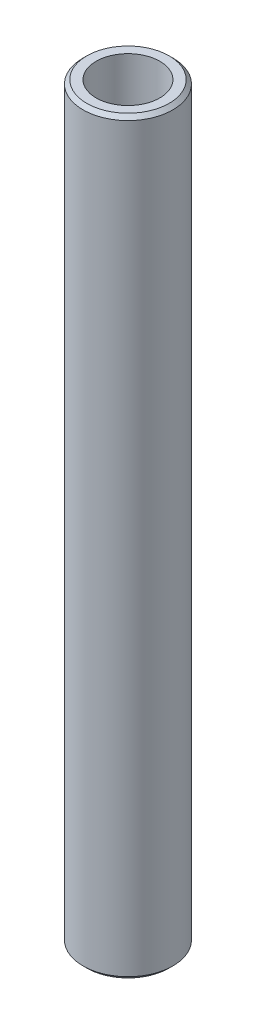
ISO-10303-21;
HEADER;
FILE_DESCRIPTION(('STEP AP214'),'2;1');
FILE_NAME('part.step','',(''),(''),'','','');
FILE_SCHEMA(('AUTOMOTIVE_DESIGN { 1 0 10303 214 1 1 1 1 }'));
ENDSEC;
DATA;
#1=APPLICATION_CONTEXT('core data for automotive mechanical design processes');
#2=APPLICATION_PROTOCOL_DEFINITION('international standard','automotive_design',2000,#1);
#3=PRODUCT_CONTEXT('',#1,'mechanical');
#4=PRODUCT('Part','Part','',(#3));
#5=PRODUCT_RELATED_PRODUCT_CATEGORY('part','',(#4));
#6=PRODUCT_DEFINITION_FORMATION('','',#4);
#7=PRODUCT_DEFINITION_CONTEXT('part definition',#1,'design');
#8=PRODUCT_DEFINITION('design','',#6,#7);
#9=PRODUCT_DEFINITION_SHAPE('','',#8);
#10=(LENGTH_UNIT() NAMED_UNIT(*) SI_UNIT(.MILLI.,.METRE.));
#11=(NAMED_UNIT(*) PLANE_ANGLE_UNIT() SI_UNIT($,.RADIAN.));
#12=(NAMED_UNIT(*) SI_UNIT($,.STERADIAN.) SOLID_ANGLE_UNIT());
#13=UNCERTAINTY_MEASURE_WITH_UNIT(LENGTH_MEASURE(1.E-05),#10,'distance_accuracy_value','');
#14=(GEOMETRIC_REPRESENTATION_CONTEXT(3) GLOBAL_UNCERTAINTY_ASSIGNED_CONTEXT((#13)) GLOBAL_UNIT_ASSIGNED_CONTEXT((#10,
#11,#12)) REPRESENTATION_CONTEXT('',''));
#15=CARTESIAN_POINT('',(0.,0.,0.));
#16=DIRECTION('',(0.,0.,1.));
#17=DIRECTION('',(1.,0.,0.));
#18=AXIS2_PLACEMENT_3D('',#15,#16,#17);
#19=CARTESIAN_POINT('',(0.,0.,0.));
#20=DIRECTION('',(0.,1.,0.));
#21=DIRECTION('',(1.,0.,0.));
#22=AXIS2_PLACEMENT_3D('',#19,#20,#21);
#23=CYLINDRICAL_SURFACE('',#22,4.25);
#24=CARTESIAN_POINT('',(0.,0.,0.));
#25=DIRECTION('',(0.,1.,0.));
#26=DIRECTION('',(1.,0.,0.));
#27=AXIS2_PLACEMENT_3D('',#24,#25,#26);
#28=CIRCLE('',#27,4.25);
#29=CARTESIAN_POINT('',(-4.25,0.,0.));
#30=VERTEX_POINT('',#29);
#31=EDGE_CURVE('E20',#30,#30,#28,.T.);
#32=ORIENTED_EDGE('',*,*,#31,.F.);
#33=DIRECTION('',(0.,1.,0.));
#34=VECTOR('',#33,1.);
#35=CARTESIAN_POINT('',(-4.25,0.,0.));
#36=LINE('',#35,#34);
#37=CARTESIAN_POINT('',(-4.25,100.,0.));
#38=VERTEX_POINT('',#37);
#39=EDGE_CURVE('E11',#30,#38,#36,.T.);
#40=ORIENTED_EDGE('',*,*,#39,.T.);
#41=CARTESIAN_POINT('',(0.,100.,0.));
#42=DIRECTION('',(0.,-1.,0.));
#43=DIRECTION('',(1.,0.,0.));
#44=AXIS2_PLACEMENT_3D('',#41,#42,#43);
#45=CIRCLE('',#44,4.25);
#46=EDGE_CURVE('E27',#38,#38,#45,.T.);
#47=ORIENTED_EDGE('',*,*,#46,.F.);
#48=ORIENTED_EDGE('',*,*,#39,.F.);
#49=EDGE_LOOP('',(#32,#40,#47,#48));
#50=FACE_BOUND('',#49,.T.);
#51=ADVANCED_FACE('F16',(#50),#23,.F.);
#52=CARTESIAN_POINT('',(0.,100.,0.));
#53=DIRECTION('',(0.,1.,0.));
#54=DIRECTION('',(1.,0.,0.));
#55=AXIS2_PLACEMENT_3D('',#52,#53,#54);
#56=PLANE('',#55);
#57=ORIENTED_EDGE('',*,*,#46,.T.);
#58=EDGE_LOOP('',(#57));
#59=FACE_BOUND('',#58,.T.);
#60=CARTESIAN_POINT('',(0.,100.,0.));
#61=DIRECTION('',(0.,-1.,0.));
#62=DIRECTION('',(1.,0.,0.));
#63=AXIS2_PLACEMENT_3D('',#60,#61,#62);
#64=CIRCLE('',#63,5.5);
#65=CARTESIAN_POINT('',(-5.5,100.,0.));
#66=VERTEX_POINT('',#65);
#67=EDGE_CURVE('E84',#66,#66,#64,.T.);
#68=ORIENTED_EDGE('',*,*,#67,.F.);
#69=EDGE_LOOP('',(#68));
#70=FACE_BOUND('',#69,.T.);
#71=ADVANCED_FACE('F108',(#59,#70),#56,.T.);
#72=CARTESIAN_POINT('',(0.,99.75,0.));
#73=DIRECTION('',(0.,-1.,0.));
#74=DIRECTION('',(1.,0.,0.));
#75=AXIS2_PLACEMENT_3D('',#72,#73,#74);
#76=CONICAL_SURFACE('',#75,5.75,0.785398163397442);
#77=ORIENTED_EDGE('',*,*,#67,.T.);
#78=DIRECTION('',(-0.707106781186543,-0.707106781186552,0.));
#79=VECTOR('',#78,1.);
#80=CARTESIAN_POINT('',(-5.75,99.75,0.));
#81=LINE('',#80,#79);
#82=CARTESIAN_POINT('',(-6.,99.5,0.));
#83=VERTEX_POINT('',#82);
#84=EDGE_CURVE('E82',#66,#83,#81,.T.);
#85=ORIENTED_EDGE('',*,*,#84,.T.);
#86=CARTESIAN_POINT('',(0.,99.5,0.));
#87=DIRECTION('',(0.,1.,0.));
#88=DIRECTION('',(1.,0.,0.));
#89=AXIS2_PLACEMENT_3D('',#86,#87,#88);
#90=CIRCLE('',#89,6.);
#91=EDGE_CURVE('E75',#83,#83,#90,.T.);
#92=ORIENTED_EDGE('',*,*,#91,.T.);
#93=ORIENTED_EDGE('',*,*,#84,.F.);
#94=EDGE_LOOP('',(#77,#85,#92,#93));
#95=FACE_BOUND('',#94,.T.);
#96=ADVANCED_FACE('F94',(#95),#76,.T.);
#97=CARTESIAN_POINT('',(0.,0.,0.));
#98=DIRECTION('',(0.,1.,0.));
#99=DIRECTION('',(1.,0.,0.));
#100=AXIS2_PLACEMENT_3D('',#97,#98,#99);
#101=PLANE('',#100);
#102=ORIENTED_EDGE('',*,*,#31,.T.);
#103=EDGE_LOOP('',(#102));
#104=FACE_BOUND('',#103,.T.);
#105=CARTESIAN_POINT('',(0.,0.,0.));
#106=DIRECTION('',(0.,1.,0.));
#107=DIRECTION('',(1.,0.,0.));
#108=AXIS2_PLACEMENT_3D('',#105,#106,#107);
#109=CIRCLE('',#108,5.5);
#110=CARTESIAN_POINT('',(-5.5,0.,0.));
#111=VERTEX_POINT('',#110);
#112=EDGE_CURVE('E68',#111,#111,#109,.T.);
#113=ORIENTED_EDGE('',*,*,#112,.F.);
#114=EDGE_LOOP('',(#113));
#115=FACE_BOUND('',#114,.T.);
#116=ADVANCED_FACE('F97',(#104,#115),#101,.F.);
#117=CARTESIAN_POINT('',(0.,0.,0.));
#118=DIRECTION('',(0.,1.,0.));
#119=DIRECTION('',(1.,0.,0.));
#120=AXIS2_PLACEMENT_3D('',#117,#118,#119);
#121=CYLINDRICAL_SURFACE('',#120,6.);
#122=ORIENTED_EDGE('',*,*,#91,.F.);
#123=DIRECTION('',(0.,-1.,0.));
#124=VECTOR('',#123,1.);
#125=CARTESIAN_POINT('',(-6.,0.,0.));
#126=LINE('',#125,#124);
#127=CARTESIAN_POINT('',(-6.,0.5,0.));
#128=VERTEX_POINT('',#127);
#129=EDGE_CURVE('E58',#83,#128,#126,.T.);
#130=ORIENTED_EDGE('',*,*,#129,.T.);
#131=CARTESIAN_POINT('',(0.,0.5,0.));
#132=DIRECTION('',(0.,-1.,0.));
#133=DIRECTION('',(1.,0.,0.));
#134=AXIS2_PLACEMENT_3D('',#131,#132,#133);
#135=CIRCLE('',#134,6.);
#136=EDGE_CURVE('E69',#128,#128,#135,.T.);
#137=ORIENTED_EDGE('',*,*,#136,.F.);
#138=ORIENTED_EDGE('',*,*,#129,.F.);
#139=EDGE_LOOP('',(#122,#130,#137,#138));
#140=FACE_BOUND('',#139,.T.);
#141=ADVANCED_FACE('F95',(#140),#121,.T.);
#142=CARTESIAN_POINT('',(0.,0.25,0.));
#143=DIRECTION('',(0.,1.,0.));
#144=DIRECTION('',(1.,0.,0.));
#145=AXIS2_PLACEMENT_3D('',#142,#143,#144);
#146=CONICAL_SURFACE('',#145,5.75,0.785398163397449);
#147=ORIENTED_EDGE('',*,*,#112,.T.);
#148=DIRECTION('',(-0.707106781186548,0.707106781186547,0.));
#149=VECTOR('',#148,1.);
#150=CARTESIAN_POINT('',(-5.75,0.25,0.));
#151=LINE('',#150,#149);
#152=EDGE_CURVE('E66',#111,#128,#151,.T.);
#153=ORIENTED_EDGE('',*,*,#152,.T.);
#154=ORIENTED_EDGE('',*,*,#136,.T.);
#155=ORIENTED_EDGE('',*,*,#152,.F.);
#156=EDGE_LOOP('',(#147,#153,#154,#155));
#157=FACE_BOUND('',#156,.T.);
#158=ADVANCED_FACE('F18',(#157),#146,.T.);
#159=CLOSED_SHELL('',(#51,#71,#96,#116,#141,#158));
#160=MANIFOLD_SOLID_BREP('B1',#159);
#161=ADVANCED_BREP_SHAPE_REPRESENTATION('',(#18,#160),#14);
#162=SHAPE_DEFINITION_REPRESENTATION(#9,#161);
ENDSEC;
END-ISO-10303-21;
